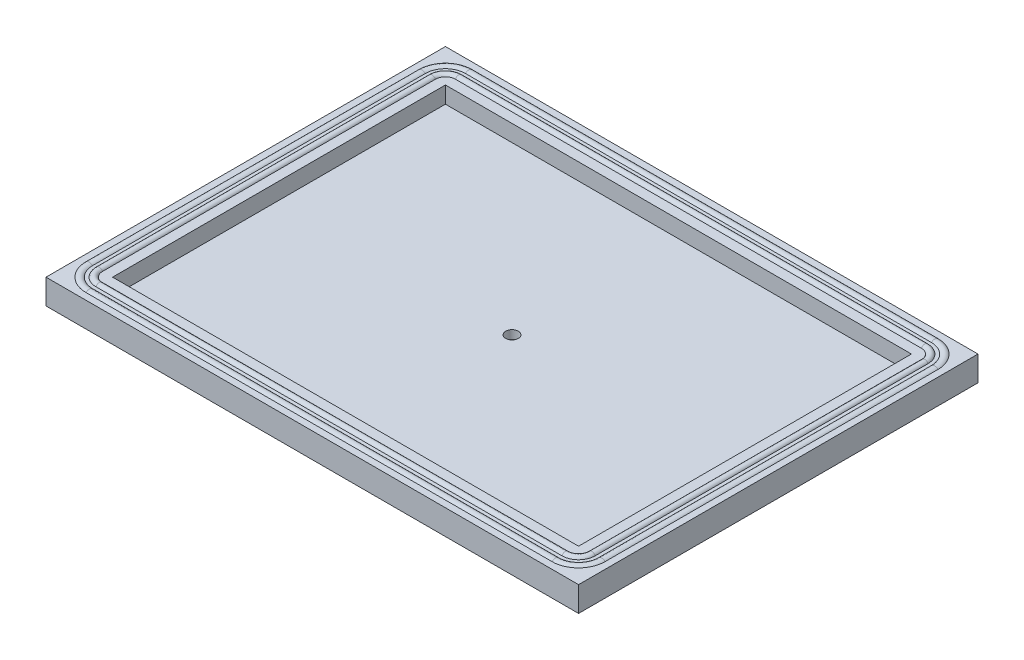
ISO-10303-21;
HEADER;
FILE_DESCRIPTION(('STEP AP214'),'2;1');
FILE_NAME('part.step','',(''),(''),'','','');
FILE_SCHEMA(('AUTOMOTIVE_DESIGN { 1 0 10303 214 1 1 1 1 }'));
ENDSEC;
DATA;
#1=APPLICATION_CONTEXT('core data for automotive mechanical design processes');
#2=APPLICATION_PROTOCOL_DEFINITION('international standard','automotive_design',2000,#1);
#3=PRODUCT_CONTEXT('',#1,'mechanical');
#4=PRODUCT('Part','Part','',(#3));
#5=PRODUCT_RELATED_PRODUCT_CATEGORY('part','',(#4));
#6=PRODUCT_DEFINITION_FORMATION('','',#4);
#7=PRODUCT_DEFINITION_CONTEXT('part definition',#1,'design');
#8=PRODUCT_DEFINITION('design','',#6,#7);
#9=PRODUCT_DEFINITION_SHAPE('','',#8);
#10=(LENGTH_UNIT() NAMED_UNIT(*) SI_UNIT(.MILLI.,.METRE.));
#11=(NAMED_UNIT(*) PLANE_ANGLE_UNIT() SI_UNIT($,.RADIAN.));
#12=(NAMED_UNIT(*) SI_UNIT($,.STERADIAN.) SOLID_ANGLE_UNIT());
#13=UNCERTAINTY_MEASURE_WITH_UNIT(LENGTH_MEASURE(1.E-05),#10,'distance_accuracy_value','');
#14=(GEOMETRIC_REPRESENTATION_CONTEXT(3) GLOBAL_UNCERTAINTY_ASSIGNED_CONTEXT((#13)) GLOBAL_UNIT_ASSIGNED_CONTEXT((#10,
#11,#12)) REPRESENTATION_CONTEXT('',''));
#15=CARTESIAN_POINT('',(0.,0.,0.));
#16=DIRECTION('',(0.,0.,1.));
#17=DIRECTION('',(1.,0.,0.));
#18=AXIS2_PLACEMENT_3D('',#15,#16,#17);
#19=CARTESIAN_POINT('',(71.4455159954874,9.525,-53.059627463619));
#20=DIRECTION('',(0.,1.,0.));
#21=DIRECTION('',(0.,0.,1.));
#22=AXIS2_PLACEMENT_3D('',#19,#20,#21);
#23=PLANE('',#22);
#24=CARTESIAN_POINT('',(84.1455159954874,9.525,86.640372536381));
#25=DIRECTION('',(0.,-1.,0.));
#26=DIRECTION('',(0.,0.,-1.));
#27=AXIS2_PLACEMENT_3D('',#24,#25,#26);
#28=CIRCLE('',#27,7.61999999999996);
#29=CARTESIAN_POINT('',(84.1455159954874,9.525,94.2603725363809));
#30=VERTEX_POINT('',#29);
#31=CARTESIAN_POINT('',(76.5255159954874,9.525,86.6403725363809));
#32=VERTEX_POINT('',#31);
#33=EDGE_CURVE('E71',#30,#32,#28,.T.);
#34=ORIENTED_EDGE('',*,*,#33,.F.);
#35=DIRECTION('',(-1.,0.,0.));
#36=VECTOR('',#35,1.);
#37=CARTESIAN_POINT('',(261.945515995487,9.525,94.2603725363809));
#38=LINE('',#37,#36);
#39=CARTESIAN_POINT('',(261.945515995487,9.525,94.2603725363809));
#40=VERTEX_POINT('',#39);
#41=EDGE_CURVE('E269',#40,#30,#38,.T.);
#42=ORIENTED_EDGE('',*,*,#41,.F.);
#43=CARTESIAN_POINT('',(261.945515995487,9.525,86.640372536381));
#44=DIRECTION('',(0.,-1.,0.));
#45=DIRECTION('',(0.,0.,-1.));
#46=AXIS2_PLACEMENT_3D('',#43,#44,#45);
#47=CIRCLE('',#46,7.61999999999996);
#48=CARTESIAN_POINT('',(269.565515995487,9.525,86.640372536381));
#49=VERTEX_POINT('',#48);
#50=EDGE_CURVE('E261',#49,#40,#47,.T.);
#51=ORIENTED_EDGE('',*,*,#50,.F.);
#52=DIRECTION('',(0.,0.,1.));
#53=VECTOR('',#52,1.);
#54=CARTESIAN_POINT('',(269.565515995487,9.525,-40.359627463619));
#55=LINE('',#54,#53);
#56=CARTESIAN_POINT('',(269.565515995487,9.525,-40.359627463619));
#57=VERTEX_POINT('',#56);
#58=EDGE_CURVE('E253',#57,#49,#55,.T.);
#59=ORIENTED_EDGE('',*,*,#58,.F.);
#60=CARTESIAN_POINT('',(261.945515995487,9.525,-40.3596274636191));
#61=DIRECTION('',(0.,-1.,0.));
#62=DIRECTION('',(0.,0.,-1.));
#63=AXIS2_PLACEMENT_3D('',#60,#61,#62);
#64=CIRCLE('',#63,7.62000000000004);
#65=CARTESIAN_POINT('',(261.945515995487,9.525,-47.9796274636191));
#66=VERTEX_POINT('',#65);
#67=EDGE_CURVE('E245',#66,#57,#64,.T.);
#68=ORIENTED_EDGE('',*,*,#67,.F.);
#69=DIRECTION('',(1.,0.,0.));
#70=VECTOR('',#69,1.);
#71=CARTESIAN_POINT('',(84.1455159954874,9.525,-47.979627463619));
#72=LINE('',#71,#70);
#73=CARTESIAN_POINT('',(84.1455159954874,9.525,-47.979627463619));
#74=VERTEX_POINT('',#73);
#75=EDGE_CURVE('E229',#74,#66,#72,.T.);
#76=ORIENTED_EDGE('',*,*,#75,.F.);
#77=CARTESIAN_POINT('',(84.1455159954874,9.525,-40.359627463619));
#78=DIRECTION('',(0.,-1.,0.));
#79=DIRECTION('',(0.,0.,-1.));
#80=AXIS2_PLACEMENT_3D('',#77,#78,#79);
#81=CIRCLE('',#80,7.62);
#82=CARTESIAN_POINT('',(76.5255159954874,9.525,-40.359627463619));
#83=VERTEX_POINT('',#82);
#84=EDGE_CURVE('E212',#83,#74,#81,.T.);
#85=ORIENTED_EDGE('',*,*,#84,.F.);
#86=DIRECTION('',(0.,0.,1.));
#87=VECTOR('',#86,1.);
#88=CARTESIAN_POINT('',(76.5255159954874,9.525,-40.359627463619));
#89=LINE('',#88,#87);
#90=EDGE_CURVE('E220',#83,#32,#89,.T.);
#91=ORIENTED_EDGE('',*,*,#90,.T.);
#92=EDGE_LOOP('',(#34,#42,#51,#59,#68,#76,#85,#91));
#93=FACE_BOUND('',#92,.T.);
#94=CARTESIAN_POINT('',(84.1455159954874,9.525,86.640372536381));
#95=DIRECTION('',(0.,-1.,0.));
#96=DIRECTION('',(0.,0.,-1.));
#97=AXIS2_PLACEMENT_3D('',#94,#95,#96);
#98=CIRCLE('',#97,6.34999999999991);
#99=CARTESIAN_POINT('',(84.1455159954874,9.525,92.9903725363809));
#100=VERTEX_POINT('',#99);
#101=CARTESIAN_POINT('',(77.7955159954875,9.525,86.6403725363809));
#102=VERTEX_POINT('',#101);
#103=EDGE_CURVE('E337',#100,#102,#98,.T.);
#104=ORIENTED_EDGE('',*,*,#103,.T.);
#105=DIRECTION('',(0.,0.,1.));
#106=VECTOR('',#105,1.);
#107=CARTESIAN_POINT('',(77.7955159954874,9.525,-40.359627463619));
#108=LINE('',#107,#106);
#109=CARTESIAN_POINT('',(77.7955159954874,9.525,-40.359627463619));
#110=VERTEX_POINT('',#109);
#111=EDGE_CURVE('E284',#110,#102,#108,.T.);
#112=ORIENTED_EDGE('',*,*,#111,.F.);
#113=CARTESIAN_POINT('',(84.1455159954874,9.525,-40.359627463619));
#114=DIRECTION('',(0.,-1.,0.));
#115=DIRECTION('',(0.,0.,-1.));
#116=AXIS2_PLACEMENT_3D('',#113,#114,#115);
#117=CIRCLE('',#116,6.34999999999998);
#118=CARTESIAN_POINT('',(84.1455159954874,9.525,-46.709627463619));
#119=VERTEX_POINT('',#118);
#120=EDGE_CURVE('E287',#110,#119,#117,.T.);
#121=ORIENTED_EDGE('',*,*,#120,.T.);
#122=DIRECTION('',(1.,0.,0.));
#123=VECTOR('',#122,1.);
#124=CARTESIAN_POINT('',(84.1455159954874,9.525,-46.709627463619));
#125=LINE('',#124,#123);
#126=CARTESIAN_POINT('',(261.945515995487,9.525,-46.7096274636191));
#127=VERTEX_POINT('',#126);
#128=EDGE_CURVE('E296',#119,#127,#125,.T.);
#129=ORIENTED_EDGE('',*,*,#128,.T.);
#130=CARTESIAN_POINT('',(261.945515995487,9.525,-40.3596274636191));
#131=DIRECTION('',(0.,-1.,0.));
#132=DIRECTION('',(0.,0.,-1.));
#133=AXIS2_PLACEMENT_3D('',#130,#131,#132);
#134=CIRCLE('',#133,6.35000000000002);
#135=CARTESIAN_POINT('',(268.295515995487,9.525,-40.359627463619));
#136=VERTEX_POINT('',#135);
#137=EDGE_CURVE('E304',#127,#136,#134,.T.);
#138=ORIENTED_EDGE('',*,*,#137,.T.);
#139=DIRECTION('',(0.,0.,1.));
#140=VECTOR('',#139,1.);
#141=CARTESIAN_POINT('',(268.295515995487,9.525,-40.359627463619));
#142=LINE('',#141,#140);
#143=CARTESIAN_POINT('',(268.295515995487,9.525,86.640372536381));
#144=VERTEX_POINT('',#143);
#145=EDGE_CURVE('E312',#136,#144,#142,.T.);
#146=ORIENTED_EDGE('',*,*,#145,.T.);
#147=CARTESIAN_POINT('',(261.945515995487,9.525,86.640372536381));
#148=DIRECTION('',(0.,-1.,0.));
#149=DIRECTION('',(0.,0.,-1.));
#150=AXIS2_PLACEMENT_3D('',#147,#148,#149);
#151=CIRCLE('',#150,6.34999999999991);
#152=CARTESIAN_POINT('',(261.945515995487,9.525,92.9903725363809));
#153=VERTEX_POINT('',#152);
#154=EDGE_CURVE('E320',#144,#153,#151,.T.);
#155=ORIENTED_EDGE('',*,*,#154,.T.);
#156=DIRECTION('',(-1.,0.,0.));
#157=VECTOR('',#156,1.);
#158=CARTESIAN_POINT('',(261.945515995487,9.525,92.9903725363809));
#159=LINE('',#158,#157);
#160=EDGE_CURVE('E328',#153,#100,#159,.T.);
#161=ORIENTED_EDGE('',*,*,#160,.T.);
#162=EDGE_LOOP('',(#104,#112,#121,#129,#138,#146,#155,#161));
#163=FACE_BOUND('',#162,.T.);
#164=ADVANCED_FACE('F47',(#93,#163),#23,.T.);
#165=CARTESIAN_POINT('',(84.1455159954874,8.90587499999998,86.640372536381));
#166=DIRECTION('',(0.,-1.,0.));
#167=DIRECTION('',(0.,0.,-1.));
#168=AXIS2_PLACEMENT_3D('',#165,#166,#167);
#169=TOROIDAL_SURFACE('',#168,5.07999999999992,1.412875);
#170=CARTESIAN_POINT('',(84.1455159954874,8.90587499999998,91.7203725363809));
#171=DIRECTION('',(-1.,0.,0.));
#172=DIRECTION('',(0.,0.,1.));
#173=AXIS2_PLACEMENT_3D('',#170,#171,#172);
#174=CIRCLE('',#173,1.412875);
#175=CARTESIAN_POINT('',(84.1455159954874,9.52500000000001,90.4503725363809));
#176=VERTEX_POINT('',#175);
#177=EDGE_CURVE('E326',#100,#176,#174,.T.);
#178=ORIENTED_EDGE('',*,*,#177,.T.);
#179=CARTESIAN_POINT('',(84.1455159954874,9.52500000000001,86.640372536381));
#180=DIRECTION('',(0.,-1.,0.));
#181=DIRECTION('',(0.,0.,-1.));
#182=AXIS2_PLACEMENT_3D('',#179,#180,#181);
#183=CIRCLE('',#182,3.80999999999992);
#184=CARTESIAN_POINT('',(80.3355159954874,9.525,86.6403725363809));
#185=VERTEX_POINT('',#184);
#186=EDGE_CURVE('E340',#176,#185,#183,.T.);
#187=ORIENTED_EDGE('',*,*,#186,.T.);
#188=CARTESIAN_POINT('',(79.0655159954875,8.90587499999998,86.6403725363809));
#189=DIRECTION('',(0.,0.,-1.));
#190=DIRECTION('',(-1.,0.,0.));
#191=AXIS2_PLACEMENT_3D('',#188,#189,#190);
#192=CIRCLE('',#191,1.412875);
#193=EDGE_CURVE('E334',#102,#185,#192,.T.);
#194=ORIENTED_EDGE('',*,*,#193,.F.);
#195=ORIENTED_EDGE('',*,*,#103,.F.);
#196=EDGE_LOOP('',(#178,#187,#194,#195));
#197=FACE_BOUND('',#196,.T.);
#198=ADVANCED_FACE('F430',(#197),#169,.T.);
#199=CARTESIAN_POINT('',(261.945515995487,8.90587499999998,91.7203725363809));
#200=DIRECTION('',(-1.,0.,0.));
#201=DIRECTION('',(0.,0.,1.));
#202=AXIS2_PLACEMENT_3D('',#199,#200,#201);
#203=CYLINDRICAL_SURFACE('',#202,1.412875);
#204=CARTESIAN_POINT('',(261.945515995487,8.90587499999998,91.7203725363809));
#205=DIRECTION('',(-1.,0.,0.));
#206=DIRECTION('',(0.,0.,1.));
#207=AXIS2_PLACEMENT_3D('',#204,#205,#206);
#208=CIRCLE('',#207,1.412875);
#209=CARTESIAN_POINT('',(261.945515995487,9.52500000000001,90.4503725363809));
#210=VERTEX_POINT('',#209);
#211=EDGE_CURVE('E318',#153,#210,#208,.T.);
#212=ORIENTED_EDGE('',*,*,#211,.T.);
#213=DIRECTION('',(-1.,0.,0.));
#214=VECTOR('',#213,1.);
#215=CARTESIAN_POINT('',(261.945515995487,9.52500000000001,90.4503725363809));
#216=LINE('',#215,#214);
#217=EDGE_CURVE('E331',#210,#176,#216,.T.);
#218=ORIENTED_EDGE('',*,*,#217,.T.);
#219=ORIENTED_EDGE('',*,*,#177,.F.);
#220=ORIENTED_EDGE('',*,*,#160,.F.);
#221=EDGE_LOOP('',(#212,#218,#219,#220));
#222=FACE_BOUND('',#221,.T.);
#223=ADVANCED_FACE('F436',(#222),#203,.T.);
#224=CARTESIAN_POINT('',(261.945515995487,8.90587499999998,86.640372536381));
#225=DIRECTION('',(0.,-1.,0.));
#226=DIRECTION('',(0.,0.,-1.));
#227=AXIS2_PLACEMENT_3D('',#224,#225,#226);
#228=TOROIDAL_SURFACE('',#227,5.07999999999992,1.412875);
#229=CARTESIAN_POINT('',(267.025515995487,8.90587499999998,86.640372536381));
#230=DIRECTION('',(0.,0.,1.));
#231=DIRECTION('',(1.,0.,0.));
#232=AXIS2_PLACEMENT_3D('',#229,#230,#231);
#233=CIRCLE('',#232,1.412875);
#234=CARTESIAN_POINT('',(265.755515995487,9.52500000000001,86.640372536381));
#235=VERTEX_POINT('',#234);
#236=EDGE_CURVE('E310',#144,#235,#233,.T.);
#237=ORIENTED_EDGE('',*,*,#236,.T.);
#238=CARTESIAN_POINT('',(261.945515995487,9.52500000000001,86.640372536381));
#239=DIRECTION('',(0.,-1.,0.));
#240=DIRECTION('',(0.,0.,-1.));
#241=AXIS2_PLACEMENT_3D('',#238,#239,#240);
#242=CIRCLE('',#241,3.80999999999992);
#243=EDGE_CURVE('E323',#235,#210,#242,.T.);
#244=ORIENTED_EDGE('',*,*,#243,.T.);
#245=ORIENTED_EDGE('',*,*,#211,.F.);
#246=ORIENTED_EDGE('',*,*,#154,.F.);
#247=EDGE_LOOP('',(#237,#244,#245,#246));
#248=FACE_BOUND('',#247,.T.);
#249=ADVANCED_FACE('F666',(#248),#228,.T.);
#250=CARTESIAN_POINT('',(267.025515995487,8.90587499999998,-40.359627463619));
#251=DIRECTION('',(0.,0.,1.));
#252=DIRECTION('',(1.,0.,0.));
#253=AXIS2_PLACEMENT_3D('',#250,#251,#252);
#254=CYLINDRICAL_SURFACE('',#253,1.412875);
#255=CARTESIAN_POINT('',(267.025515995487,8.90587499999998,-40.359627463619));
#256=DIRECTION('',(0.,0.,1.));
#257=DIRECTION('',(1.,0.,0.));
#258=AXIS2_PLACEMENT_3D('',#255,#256,#257);
#259=CIRCLE('',#258,1.412875);
#260=CARTESIAN_POINT('',(265.755515995487,9.52500000000001,-40.359627463619));
#261=VERTEX_POINT('',#260);
#262=EDGE_CURVE('E302',#136,#261,#259,.T.);
#263=ORIENTED_EDGE('',*,*,#262,.T.);
#264=DIRECTION('',(0.,0.,1.));
#265=VECTOR('',#264,1.);
#266=CARTESIAN_POINT('',(265.755515995487,9.52500000000001,-40.359627463619));
#267=LINE('',#266,#265);
#268=EDGE_CURVE('E315',#261,#235,#267,.T.);
#269=ORIENTED_EDGE('',*,*,#268,.T.);
#270=ORIENTED_EDGE('',*,*,#236,.F.);
#271=ORIENTED_EDGE('',*,*,#145,.F.);
#272=EDGE_LOOP('',(#263,#269,#270,#271));
#273=FACE_BOUND('',#272,.T.);
#274=ADVANCED_FACE('F656',(#273),#254,.T.);
#275=CARTESIAN_POINT('',(261.945515995487,8.90587499999998,-40.3596274636191));
#276=DIRECTION('',(0.,-1.,0.));
#277=DIRECTION('',(0.,0.,-1.));
#278=AXIS2_PLACEMENT_3D('',#275,#276,#277);
#279=TOROIDAL_SURFACE('',#278,5.08000000000004,1.412875);
#280=CARTESIAN_POINT('',(261.945515995487,8.90587499999998,-45.4396274636191));
#281=DIRECTION('',(1.,0.,0.));
#282=DIRECTION('',(0.,0.,-1.));
#283=AXIS2_PLACEMENT_3D('',#280,#281,#282);
#284=CIRCLE('',#283,1.412875);
#285=CARTESIAN_POINT('',(261.945515995487,9.52500000000001,-44.1696274636191));
#286=VERTEX_POINT('',#285);
#287=EDGE_CURVE('E294',#127,#286,#284,.T.);
#288=ORIENTED_EDGE('',*,*,#287,.T.);
#289=CARTESIAN_POINT('',(261.945515995487,9.52500000000001,-40.3596274636191));
#290=DIRECTION('',(0.,-1.,0.));
#291=DIRECTION('',(0.,0.,-1.));
#292=AXIS2_PLACEMENT_3D('',#289,#290,#291);
#293=CIRCLE('',#292,3.81000000000003);
#294=EDGE_CURVE('E307',#286,#261,#293,.T.);
#295=ORIENTED_EDGE('',*,*,#294,.T.);
#296=ORIENTED_EDGE('',*,*,#262,.F.);
#297=ORIENTED_EDGE('',*,*,#137,.F.);
#298=EDGE_LOOP('',(#288,#295,#296,#297));
#299=FACE_BOUND('',#298,.T.);
#300=ADVANCED_FACE('F646',(#299),#279,.T.);
#301=CARTESIAN_POINT('',(84.1455159954874,8.90587499999998,-45.439627463619));
#302=DIRECTION('',(1.,0.,0.));
#303=DIRECTION('',(0.,0.,-1.));
#304=AXIS2_PLACEMENT_3D('',#301,#302,#303);
#305=CYLINDRICAL_SURFACE('',#304,1.412875);
#306=CARTESIAN_POINT('',(84.1455159954874,8.90587499999998,-45.439627463619));
#307=DIRECTION('',(1.,0.,0.));
#308=DIRECTION('',(0.,0.,-1.));
#309=AXIS2_PLACEMENT_3D('',#306,#307,#308);
#310=CIRCLE('',#309,1.412875);
#311=CARTESIAN_POINT('',(84.1455159954874,9.52500000000001,-44.169627463619));
#312=VERTEX_POINT('',#311);
#313=EDGE_CURVE('E285',#119,#312,#310,.T.);
#314=ORIENTED_EDGE('',*,*,#313,.T.);
#315=DIRECTION('',(1.,0.,0.));
#316=VECTOR('',#315,1.);
#317=CARTESIAN_POINT('',(84.1455159954874,9.52500000000001,-44.169627463619));
#318=LINE('',#317,#316);
#319=EDGE_CURVE('E299',#312,#286,#318,.T.);
#320=ORIENTED_EDGE('',*,*,#319,.T.);
#321=ORIENTED_EDGE('',*,*,#287,.F.);
#322=ORIENTED_EDGE('',*,*,#128,.F.);
#323=EDGE_LOOP('',(#314,#320,#321,#322));
#324=FACE_BOUND('',#323,.T.);
#325=ADVANCED_FACE('F636',(#324),#305,.T.);
#326=CARTESIAN_POINT('',(84.1455159954874,8.90587499999998,-40.359627463619));
#327=DIRECTION('',(0.,-1.,0.));
#328=DIRECTION('',(0.,0.,-1.));
#329=AXIS2_PLACEMENT_3D('',#326,#327,#328);
#330=TOROIDAL_SURFACE('',#329,5.08,1.412875);
#331=CARTESIAN_POINT('',(79.0655159954874,8.90587499999998,-40.359627463619));
#332=DIRECTION('',(0.,0.,-1.));
#333=DIRECTION('',(-1.,0.,0.));
#334=AXIS2_PLACEMENT_3D('',#331,#332,#333);
#335=CIRCLE('',#334,1.412875);
#336=CARTESIAN_POINT('',(80.3355159954874,9.52500000000001,-40.359627463619));
#337=VERTEX_POINT('',#336);
#338=EDGE_CURVE('E276',#110,#337,#335,.T.);
#339=ORIENTED_EDGE('',*,*,#338,.T.);
#340=CARTESIAN_POINT('',(84.1455159954874,9.52500000000001,-40.359627463619));
#341=DIRECTION('',(0.,-1.,0.));
#342=DIRECTION('',(0.,0.,-1.));
#343=AXIS2_PLACEMENT_3D('',#340,#341,#342);
#344=CIRCLE('',#343,3.80999999999999);
#345=EDGE_CURVE('E291',#337,#312,#344,.T.);
#346=ORIENTED_EDGE('',*,*,#345,.T.);
#347=ORIENTED_EDGE('',*,*,#313,.F.);
#348=ORIENTED_EDGE('',*,*,#120,.F.);
#349=EDGE_LOOP('',(#339,#346,#347,#348));
#350=FACE_BOUND('',#349,.T.);
#351=ADVANCED_FACE('F625',(#350),#330,.T.);
#352=CARTESIAN_POINT('',(79.0655159954874,8.90587499999998,-40.359627463619));
#353=DIRECTION('',(0.,0.,1.));
#354=DIRECTION('',(1.,0.,0.));
#355=AXIS2_PLACEMENT_3D('',#352,#353,#354);
#356=CYLINDRICAL_SURFACE('',#355,1.412875);
#357=ORIENTED_EDGE('',*,*,#111,.T.);
#358=ORIENTED_EDGE('',*,*,#193,.T.);
#359=DIRECTION('',(0.,0.,1.));
#360=VECTOR('',#359,1.);
#361=CARTESIAN_POINT('',(80.3355159954874,9.52500000000001,-40.359627463619));
#362=LINE('',#361,#360);
#363=EDGE_CURVE('E288',#337,#185,#362,.T.);
#364=ORIENTED_EDGE('',*,*,#363,.F.);
#365=ORIENTED_EDGE('',*,*,#338,.F.);
#366=EDGE_LOOP('',(#357,#358,#364,#365));
#367=FACE_BOUND('',#366,.T.);
#368=ADVANCED_FACE('F483',(#367),#356,.T.);
#369=CARTESIAN_POINT('',(71.4455159954874,3.175,-53.059627463619));
#370=DIRECTION('',(0.,1.,0.));
#371=DIRECTION('',(0.,0.,1.));
#372=AXIS2_PLACEMENT_3D('',#369,#370,#371);
#373=PLANE('',#372);
#374=CARTESIAN_POINT('',(173.045515995487,3.175,23.140372536381));
#375=DIRECTION('',(0.,1.,0.));
#376=DIRECTION('',(0.,0.,1.));
#377=AXIS2_PLACEMENT_3D('',#374,#375,#376);
#378=CIRCLE('',#377,2.413);
#379=CARTESIAN_POINT('',(173.045515995487,3.175,25.553372536381));
#380=VERTEX_POINT('',#379);
#381=EDGE_CURVE('E51',#380,#380,#378,.T.);
#382=ORIENTED_EDGE('',*,*,#381,.F.);
#383=EDGE_LOOP('',(#382));
#384=FACE_BOUND('',#383,.T.);
#385=DIRECTION('',(1.,0.,0.));
#386=VECTOR('',#385,1.);
#387=CARTESIAN_POINT('',(261.945515995487,3.17500000000001,-40.3596274636191));
#388=LINE('',#387,#386);
#389=CARTESIAN_POINT('',(84.1455159954874,3.17500000000001,-40.359627463619));
#390=VERTEX_POINT('',#389);
#391=CARTESIAN_POINT('',(261.945515995487,3.17500000000001,-40.3596274636191));
#392=VERTEX_POINT('',#391);
#393=EDGE_CURVE('E355',#390,#392,#388,.T.);
#394=ORIENTED_EDGE('',*,*,#393,.F.);
#395=DIRECTION('',(0.,0.,-1.));
#396=VECTOR('',#395,1.);
#397=CARTESIAN_POINT('',(84.1455159954874,3.17500000000001,86.640372536381));
#398=LINE('',#397,#396);
#399=CARTESIAN_POINT('',(84.1455159954874,3.17500000000001,86.640372536381));
#400=VERTEX_POINT('',#399);
#401=EDGE_CURVE('E357',#400,#390,#398,.T.);
#402=ORIENTED_EDGE('',*,*,#401,.F.);
#403=DIRECTION('',(-1.,0.,0.));
#404=VECTOR('',#403,1.);
#405=CARTESIAN_POINT('',(261.945515995487,3.17500000000001,86.640372536381));
#406=LINE('',#405,#404);
#407=CARTESIAN_POINT('',(261.945515995487,3.17500000000001,86.640372536381));
#408=VERTEX_POINT('',#407);
#409=EDGE_CURVE('E350',#408,#400,#406,.T.);
#410=ORIENTED_EDGE('',*,*,#409,.F.);
#411=DIRECTION('',(0.,0.,1.));
#412=VECTOR('',#411,1.);
#413=CARTESIAN_POINT('',(261.945515995487,3.17500000000001,86.640372536381));
#414=LINE('',#413,#412);
#415=EDGE_CURVE('E352',#392,#408,#414,.T.);
#416=ORIENTED_EDGE('',*,*,#415,.F.);
#417=EDGE_LOOP('',(#394,#402,#410,#416));
#418=FACE_BOUND('',#417,.T.);
#419=ADVANCED_FACE('F479',(#384,#418),#373,.T.);
#420=CARTESIAN_POINT('',(84.1455159954874,-218.499061782883,86.640372536381));
#421=DIRECTION('',(-1.,0.,0.));
#422=DIRECTION('',(0.,0.,1.));
#423=AXIS2_PLACEMENT_3D('',#420,#421,#422);
#424=PLANE('',#423);
#425=ORIENTED_EDGE('',*,*,#401,.T.);
#426=DIRECTION('',(0.,1.,0.));
#427=VECTOR('',#426,1.);
#428=CARTESIAN_POINT('',(84.1455159954874,-218.499061782883,-40.359627463619));
#429=LINE('',#428,#427);
#430=CARTESIAN_POINT('',(84.1455159954874,9.525,-40.359627463619));
#431=VERTEX_POINT('',#430);
#432=EDGE_CURVE('E368',#390,#431,#429,.T.);
#433=ORIENTED_EDGE('',*,*,#432,.T.);
#434=DIRECTION('',(0.,0.,1.));
#435=VECTOR('',#434,1.);
#436=CARTESIAN_POINT('',(84.1455159954874,9.525,86.640372536381));
#437=LINE('',#436,#435);
#438=CARTESIAN_POINT('',(84.1455159954874,9.525,86.640372536381));
#439=VERTEX_POINT('',#438);
#440=EDGE_CURVE('E359',#431,#439,#437,.T.);
#441=ORIENTED_EDGE('',*,*,#440,.T.);
#442=DIRECTION('',(0.,1.,0.));
#443=VECTOR('',#442,1.);
#444=CARTESIAN_POINT('',(84.1455159954874,-218.499061782883,86.640372536381));
#445=LINE('',#444,#443);
#446=EDGE_CURVE('E372',#400,#439,#445,.T.);
#447=ORIENTED_EDGE('',*,*,#446,.F.);
#448=EDGE_LOOP('',(#425,#433,#441,#447));
#449=FACE_BOUND('',#448,.T.);
#450=ADVANCED_FACE('F482',(#449),#424,.F.);
#451=CARTESIAN_POINT('',(261.945515995487,-218.499061782883,86.640372536381));
#452=DIRECTION('',(0.,0.,1.));
#453=DIRECTION('',(1.,0.,0.));
#454=AXIS2_PLACEMENT_3D('',#451,#452,#453);
#455=PLANE('',#454);
#456=ORIENTED_EDGE('',*,*,#409,.T.);
#457=ORIENTED_EDGE('',*,*,#446,.T.);
#458=DIRECTION('',(1.,0.,0.));
#459=VECTOR('',#458,1.);
#460=CARTESIAN_POINT('',(261.945515995487,9.525,86.640372536381));
#461=LINE('',#460,#459);
#462=CARTESIAN_POINT('',(261.945515995487,9.525,86.640372536381));
#463=VERTEX_POINT('',#462);
#464=EDGE_CURVE('E362',#439,#463,#461,.T.);
#465=ORIENTED_EDGE('',*,*,#464,.T.);
#466=DIRECTION('',(0.,1.,0.));
#467=VECTOR('',#466,1.);
#468=CARTESIAN_POINT('',(261.945515995487,-218.499061782883,86.640372536381));
#469=LINE('',#468,#467);
#470=EDGE_CURVE('E370',#408,#463,#469,.T.);
#471=ORIENTED_EDGE('',*,*,#470,.F.);
#472=EDGE_LOOP('',(#456,#457,#465,#471));
#473=FACE_BOUND('',#472,.T.);
#474=ADVANCED_FACE('F501',(#473),#455,.F.);
#475=CARTESIAN_POINT('',(261.945515995487,-218.499061782883,86.640372536381));
#476=DIRECTION('',(1.,0.,0.));
#477=DIRECTION('',(0.,0.,-1.));
#478=AXIS2_PLACEMENT_3D('',#475,#476,#477);
#479=PLANE('',#478);
#480=ORIENTED_EDGE('',*,*,#415,.T.);
#481=ORIENTED_EDGE('',*,*,#470,.T.);
#482=DIRECTION('',(0.,0.,-1.));
#483=VECTOR('',#482,1.);
#484=CARTESIAN_POINT('',(261.945515995487,9.525,86.640372536381));
#485=LINE('',#484,#483);
#486=CARTESIAN_POINT('',(261.945515995487,9.525,-40.3596274636191));
#487=VERTEX_POINT('',#486);
#488=EDGE_CURVE('E365',#463,#487,#485,.T.);
#489=ORIENTED_EDGE('',*,*,#488,.T.);
#490=DIRECTION('',(0.,1.,0.));
#491=VECTOR('',#490,1.);
#492=CARTESIAN_POINT('',(261.945515995487,-218.499061782883,-40.3596274636191));
#493=LINE('',#492,#491);
#494=EDGE_CURVE('E353',#392,#487,#493,.T.);
#495=ORIENTED_EDGE('',*,*,#494,.F.);
#496=EDGE_LOOP('',(#480,#481,#489,#495));
#497=FACE_BOUND('',#496,.T.);
#498=ADVANCED_FACE('F503',(#497),#479,.F.);
#499=CARTESIAN_POINT('',(261.945515995487,-218.499061782883,-40.3596274636191));
#500=DIRECTION('',(0.,0.,-1.));
#501=DIRECTION('',(-1.,0.,0.));
#502=AXIS2_PLACEMENT_3D('',#499,#500,#501);
#503=PLANE('',#502);
#504=ORIENTED_EDGE('',*,*,#393,.T.);
#505=ORIENTED_EDGE('',*,*,#494,.T.);
#506=DIRECTION('',(-1.,0.,0.));
#507=VECTOR('',#506,1.);
#508=CARTESIAN_POINT('',(261.945515995487,9.525,-40.3596274636191));
#509=LINE('',#508,#507);
#510=EDGE_CURVE('E342',#487,#431,#509,.T.);
#511=ORIENTED_EDGE('',*,*,#510,.T.);
#512=ORIENTED_EDGE('',*,*,#432,.F.);
#513=EDGE_LOOP('',(#504,#505,#511,#512));
#514=FACE_BOUND('',#513,.T.);
#515=ADVANCED_FACE('F443',(#514),#503,.F.);
#516=ORIENTED_EDGE('',*,*,#186,.F.);
#517=ORIENTED_EDGE('',*,*,#217,.F.);
#518=ORIENTED_EDGE('',*,*,#243,.F.);
#519=ORIENTED_EDGE('',*,*,#268,.F.);
#520=ORIENTED_EDGE('',*,*,#294,.F.);
#521=ORIENTED_EDGE('',*,*,#319,.F.);
#522=ORIENTED_EDGE('',*,*,#345,.F.);
#523=ORIENTED_EDGE('',*,*,#363,.T.);
#524=EDGE_LOOP('',(#516,#517,#518,#519,#520,#521,#522,#523));
#525=FACE_BOUND('',#524,.T.);
#526=ORIENTED_EDGE('',*,*,#510,.F.);
#527=ORIENTED_EDGE('',*,*,#488,.F.);
#528=ORIENTED_EDGE('',*,*,#464,.F.);
#529=ORIENTED_EDGE('',*,*,#440,.F.);
#530=EDGE_LOOP('',(#526,#527,#528,#529));
#531=FACE_BOUND('',#530,.T.);
#532=ADVANCED_FACE('F432',(#525,#531),#23,.T.);
#533=CARTESIAN_POINT('',(84.1455159954874,8.19150000000001,86.640372536381));
#534=DIRECTION('',(0.,-1.,0.));
#535=DIRECTION('',(0.,0.,-1.));
#536=AXIS2_PLACEMENT_3D('',#533,#534,#535);
#537=TOROIDAL_SURFACE('',#536,8.88999999999995,1.84149999999999);
#538=CARTESIAN_POINT('',(84.1455159954874,8.19150000000001,95.5303725363809));
#539=DIRECTION('',(-1.,0.,0.));
#540=DIRECTION('',(0.,0.,-1.));
#541=AXIS2_PLACEMENT_3D('',#538,#539,#540);
#542=CIRCLE('',#541,1.84149999999999);
#543=CARTESIAN_POINT('',(84.1455159954874,9.525,96.8003725363809));
#544=VERTEX_POINT('',#543);
#545=EDGE_CURVE('E264',#544,#30,#542,.T.);
#546=ORIENTED_EDGE('',*,*,#545,.T.);
#547=ORIENTED_EDGE('',*,*,#33,.T.);
#548=CARTESIAN_POINT('',(75.2555159954875,8.19150000000001,86.6403725363809));
#549=DIRECTION('',(0.,0.,-1.));
#550=DIRECTION('',(1.,0.,0.));
#551=AXIS2_PLACEMENT_3D('',#548,#549,#550);
#552=CIRCLE('',#551,1.84149999999999);
#553=CARTESIAN_POINT('',(73.9855159954875,9.525,86.6403725363809));
#554=VERTEX_POINT('',#553);
#555=EDGE_CURVE('E222',#554,#32,#552,.T.);
#556=ORIENTED_EDGE('',*,*,#555,.F.);
#557=CARTESIAN_POINT('',(84.1455159954874,9.525,86.640372536381));
#558=DIRECTION('',(0.,-1.,0.));
#559=DIRECTION('',(0.,0.,-1.));
#560=AXIS2_PLACEMENT_3D('',#557,#558,#559);
#561=CIRCLE('',#560,10.1599999999999);
#562=EDGE_CURVE('E273',#544,#554,#561,.T.);
#563=ORIENTED_EDGE('',*,*,#562,.F.);
#564=EDGE_LOOP('',(#546,#547,#556,#563));
#565=FACE_BOUND('',#564,.T.);
#566=ADVANCED_FACE('F442',(#565),#537,.T.);
#567=CARTESIAN_POINT('',(261.945515995487,8.19150000000001,95.5303725363809));
#568=DIRECTION('',(-1.,0.,0.));
#569=DIRECTION('',(0.,0.,1.));
#570=AXIS2_PLACEMENT_3D('',#567,#568,#569);
#571=CYLINDRICAL_SURFACE('',#570,1.84149999999999);
#572=CARTESIAN_POINT('',(261.945515995487,8.19150000000001,95.5303725363809));
#573=DIRECTION('',(-1.,0.,0.));
#574=DIRECTION('',(0.,0.,-1.));
#575=AXIS2_PLACEMENT_3D('',#572,#573,#574);
#576=CIRCLE('',#575,1.84149999999999);
#577=CARTESIAN_POINT('',(261.945515995487,9.525,96.8003725363809));
#578=VERTEX_POINT('',#577);
#579=EDGE_CURVE('E256',#578,#40,#576,.T.);
#580=ORIENTED_EDGE('',*,*,#579,.T.);
#581=ORIENTED_EDGE('',*,*,#41,.T.);
#582=ORIENTED_EDGE('',*,*,#545,.F.);
#583=DIRECTION('',(-1.,0.,0.));
#584=VECTOR('',#583,1.);
#585=CARTESIAN_POINT('',(261.945515995487,9.525,96.8003725363809));
#586=LINE('',#585,#584);
#587=EDGE_CURVE('E266',#578,#544,#586,.T.);
#588=ORIENTED_EDGE('',*,*,#587,.F.);
#589=EDGE_LOOP('',(#580,#581,#582,#588));
#590=FACE_BOUND('',#589,.T.);
#591=ADVANCED_FACE('F455',(#590),#571,.T.);
#592=CARTESIAN_POINT('',(261.945515995487,8.19150000000001,86.640372536381));
#593=DIRECTION('',(0.,-1.,0.));
#594=DIRECTION('',(0.,0.,-1.));
#595=AXIS2_PLACEMENT_3D('',#592,#593,#594);
#596=TOROIDAL_SURFACE('',#595,8.88999999999995,1.84149999999999);
#597=CARTESIAN_POINT('',(270.835515995487,8.19150000000001,86.640372536381));
#598=DIRECTION('',(0.,0.,1.));
#599=DIRECTION('',(-1.,0.,0.));
#600=AXIS2_PLACEMENT_3D('',#597,#598,#599);
#601=CIRCLE('',#600,1.84149999999999);
#602=CARTESIAN_POINT('',(272.105515995487,9.525,86.640372536381));
#603=VERTEX_POINT('',#602);
#604=EDGE_CURVE('E248',#603,#49,#601,.T.);
#605=ORIENTED_EDGE('',*,*,#604,.T.);
#606=ORIENTED_EDGE('',*,*,#50,.T.);
#607=ORIENTED_EDGE('',*,*,#579,.F.);
#608=CARTESIAN_POINT('',(261.945515995487,9.525,86.640372536381));
#609=DIRECTION('',(0.,-1.,0.));
#610=DIRECTION('',(0.,0.,-1.));
#611=AXIS2_PLACEMENT_3D('',#608,#609,#610);
#612=CIRCLE('',#611,10.1599999999999);
#613=EDGE_CURVE('E258',#603,#578,#612,.T.);
#614=ORIENTED_EDGE('',*,*,#613,.F.);
#615=EDGE_LOOP('',(#605,#606,#607,#614));
#616=FACE_BOUND('',#615,.T.);
#617=ADVANCED_FACE('F461',(#616),#596,.T.);
#618=CARTESIAN_POINT('',(270.835515995487,8.19150000000001,-40.359627463619));
#619=DIRECTION('',(0.,0.,1.));
#620=DIRECTION('',(1.,0.,0.));
#621=AXIS2_PLACEMENT_3D('',#618,#619,#620);
#622=CYLINDRICAL_SURFACE('',#621,1.84149999999999);
#623=CARTESIAN_POINT('',(270.835515995487,8.19150000000001,-40.359627463619));
#624=DIRECTION('',(0.,0.,1.));
#625=DIRECTION('',(-1.,0.,0.));
#626=AXIS2_PLACEMENT_3D('',#623,#624,#625);
#627=CIRCLE('',#626,1.84149999999999);
#628=CARTESIAN_POINT('',(272.105515995487,9.525,-40.359627463619));
#629=VERTEX_POINT('',#628);
#630=EDGE_CURVE('E240',#629,#57,#627,.T.);
#631=ORIENTED_EDGE('',*,*,#630,.T.);
#632=ORIENTED_EDGE('',*,*,#58,.T.);
#633=ORIENTED_EDGE('',*,*,#604,.F.);
#634=DIRECTION('',(0.,0.,1.));
#635=VECTOR('',#634,1.);
#636=CARTESIAN_POINT('',(272.105515995487,9.525,-40.359627463619));
#637=LINE('',#636,#635);
#638=EDGE_CURVE('E250',#629,#603,#637,.T.);
#639=ORIENTED_EDGE('',*,*,#638,.F.);
#640=EDGE_LOOP('',(#631,#632,#633,#639));
#641=FACE_BOUND('',#640,.T.);
#642=ADVANCED_FACE('F464',(#641),#622,.T.);
#643=CARTESIAN_POINT('',(261.945515995487,8.19150000000001,-40.3596274636191));
#644=DIRECTION('',(0.,-1.,0.));
#645=DIRECTION('',(0.,0.,-1.));
#646=AXIS2_PLACEMENT_3D('',#643,#644,#645);
#647=TOROIDAL_SURFACE('',#646,8.89000000000003,1.84149999999999);
#648=CARTESIAN_POINT('',(261.945515995487,8.19150000000001,-49.2496274636191));
#649=DIRECTION('',(1.,0.,0.));
#650=DIRECTION('',(0.,0.,1.));
#651=AXIS2_PLACEMENT_3D('',#648,#649,#650);
#652=CIRCLE('',#651,1.84149999999999);
#653=CARTESIAN_POINT('',(261.945515995487,9.525,-50.5196274636191));
#654=VERTEX_POINT('',#653);
#655=EDGE_CURVE('E230',#654,#66,#652,.T.);
#656=ORIENTED_EDGE('',*,*,#655,.T.);
#657=ORIENTED_EDGE('',*,*,#67,.T.);
#658=ORIENTED_EDGE('',*,*,#630,.F.);
#659=CARTESIAN_POINT('',(261.945515995487,9.525,-40.3596274636191));
#660=DIRECTION('',(0.,-1.,0.));
#661=DIRECTION('',(0.,0.,-1.));
#662=AXIS2_PLACEMENT_3D('',#659,#660,#661);
#663=CIRCLE('',#662,10.16);
#664=EDGE_CURVE('E242',#654,#629,#663,.T.);
#665=ORIENTED_EDGE('',*,*,#664,.F.);
#666=EDGE_LOOP('',(#656,#657,#658,#665));
#667=FACE_BOUND('',#666,.T.);
#668=ADVANCED_FACE('F467',(#667),#647,.T.);
#669=CARTESIAN_POINT('',(84.1455159954874,8.19150000000001,-49.249627463619));
#670=DIRECTION('',(1.,0.,0.));
#671=DIRECTION('',(0.,0.,-1.));
#672=AXIS2_PLACEMENT_3D('',#669,#670,#671);
#673=CYLINDRICAL_SURFACE('',#672,1.84149999999999);
#674=CARTESIAN_POINT('',(84.1455159954874,8.19150000000001,-49.249627463619));
#675=DIRECTION('',(1.,0.,0.));
#676=DIRECTION('',(0.,0.,1.));
#677=AXIS2_PLACEMENT_3D('',#674,#675,#676);
#678=CIRCLE('',#677,1.84149999999999);
#679=CARTESIAN_POINT('',(84.1455159954874,9.525,-50.519627463619));
#680=VERTEX_POINT('',#679);
#681=EDGE_CURVE('E224',#680,#74,#678,.T.);
#682=ORIENTED_EDGE('',*,*,#681,.T.);
#683=ORIENTED_EDGE('',*,*,#75,.T.);
#684=ORIENTED_EDGE('',*,*,#655,.F.);
#685=DIRECTION('',(1.,0.,0.));
#686=VECTOR('',#685,1.);
#687=CARTESIAN_POINT('',(84.1455159954874,9.525,-50.519627463619));
#688=LINE('',#687,#686);
#689=EDGE_CURVE('E232',#680,#654,#688,.T.);
#690=ORIENTED_EDGE('',*,*,#689,.F.);
#691=EDGE_LOOP('',(#682,#683,#684,#690));
#692=FACE_BOUND('',#691,.T.);
#693=ADVANCED_FACE('F470',(#692),#673,.T.);
#694=CARTESIAN_POINT('',(84.1455159954874,8.19150000000001,-40.359627463619));
#695=DIRECTION('',(0.,-1.,0.));
#696=DIRECTION('',(0.,0.,-1.));
#697=AXIS2_PLACEMENT_3D('',#694,#695,#696);
#698=TOROIDAL_SURFACE('',#697,8.89,1.84149999999999);
#699=CARTESIAN_POINT('',(75.2555159954874,8.19150000000001,-40.359627463619));
#700=DIRECTION('',(0.,0.,-1.));
#701=DIRECTION('',(1.,0.,0.));
#702=AXIS2_PLACEMENT_3D('',#699,#700,#701);
#703=CIRCLE('',#702,1.84149999999999);
#704=CARTESIAN_POINT('',(73.9855159954874,9.525,-40.359627463619));
#705=VERTEX_POINT('',#704);
#706=EDGE_CURVE('E63',#705,#83,#703,.T.);
#707=ORIENTED_EDGE('',*,*,#706,.T.);
#708=ORIENTED_EDGE('',*,*,#84,.T.);
#709=ORIENTED_EDGE('',*,*,#681,.F.);
#710=CARTESIAN_POINT('',(84.1455159954874,9.525,-40.359627463619));
#711=DIRECTION('',(0.,-1.,0.));
#712=DIRECTION('',(0.,0.,-1.));
#713=AXIS2_PLACEMENT_3D('',#710,#711,#712);
#714=CIRCLE('',#713,10.16);
#715=EDGE_CURVE('E215',#705,#680,#714,.T.);
#716=ORIENTED_EDGE('',*,*,#715,.F.);
#717=EDGE_LOOP('',(#707,#708,#709,#716));
#718=FACE_BOUND('',#717,.T.);
#719=ADVANCED_FACE('F209',(#718),#698,.T.);
#720=CARTESIAN_POINT('',(75.2555159954874,8.19150000000001,-40.359627463619));
#721=DIRECTION('',(0.,0.,1.));
#722=DIRECTION('',(1.,0.,0.));
#723=AXIS2_PLACEMENT_3D('',#720,#721,#722);
#724=CYLINDRICAL_SURFACE('',#723,1.84149999999999);
#725=DIRECTION('',(0.,0.,1.));
#726=VECTOR('',#725,1.);
#727=CARTESIAN_POINT('',(73.9855159954874,9.525,-40.359627463619));
#728=LINE('',#727,#726);
#729=EDGE_CURVE('E217',#705,#554,#728,.T.);
#730=ORIENTED_EDGE('',*,*,#729,.T.);
#731=ORIENTED_EDGE('',*,*,#555,.T.);
#732=ORIENTED_EDGE('',*,*,#90,.F.);
#733=ORIENTED_EDGE('',*,*,#706,.F.);
#734=EDGE_LOOP('',(#730,#731,#732,#733));
#735=FACE_BOUND('',#734,.T.);
#736=ADVANCED_FACE('F221',(#735),#724,.T.);
#737=CARTESIAN_POINT('',(71.4455159954874,0.,-53.059627463619));
#738=DIRECTION('',(0.,1.,0.));
#739=DIRECTION('',(0.,0.,1.));
#740=AXIS2_PLACEMENT_3D('',#737,#738,#739);
#741=PLANE('',#740);
#742=CARTESIAN_POINT('',(173.045515995487,0.,23.140372536381));
#743=DIRECTION('',(0.,-1.,0.));
#744=DIRECTION('',(0.,0.,-1.));
#745=AXIS2_PLACEMENT_3D('',#742,#743,#744);
#746=CIRCLE('',#745,2.413);
#747=CARTESIAN_POINT('',(173.045515995487,0.,20.727372536381));
#748=VERTEX_POINT('',#747);
#749=EDGE_CURVE('E472',#748,#748,#746,.T.);
#750=ORIENTED_EDGE('',*,*,#749,.F.);
#751=EDGE_LOOP('',(#750));
#752=FACE_BOUND('',#751,.T.);
#753=DIRECTION('',(-1.,0.,0.));
#754=VECTOR('',#753,1.);
#755=CARTESIAN_POINT('',(274.645515995487,0.,-53.059627463619));
#756=LINE('',#755,#754);
#757=CARTESIAN_POINT('',(274.645515995487,0.,-53.059627463619));
#758=VERTEX_POINT('',#757);
#759=CARTESIAN_POINT('',(71.4455159954874,0.,-53.059627463619));
#760=VERTEX_POINT('',#759);
#761=EDGE_CURVE('E377',#758,#760,#756,.T.);
#762=ORIENTED_EDGE('',*,*,#761,.F.);
#763=DIRECTION('',(0.,0.,-1.));
#764=VECTOR('',#763,1.);
#765=CARTESIAN_POINT('',(274.645515995487,0.,99.3403725363809));
#766=LINE('',#765,#764);
#767=CARTESIAN_POINT('',(274.645515995487,0.,99.3403725363809));
#768=VERTEX_POINT('',#767);
#769=EDGE_CURVE('E382',#768,#758,#766,.T.);
#770=ORIENTED_EDGE('',*,*,#769,.F.);
#771=DIRECTION('',(1.,0.,0.));
#772=VECTOR('',#771,1.);
#773=CARTESIAN_POINT('',(71.4455159954874,0.,99.340372536381));
#774=LINE('',#773,#772);
#775=CARTESIAN_POINT('',(71.4455159954874,0.,99.340372536381));
#776=VERTEX_POINT('',#775);
#777=EDGE_CURVE('E393',#776,#768,#774,.T.);
#778=ORIENTED_EDGE('',*,*,#777,.F.);
#779=DIRECTION('',(0.,0.,1.));
#780=VECTOR('',#779,1.);
#781=CARTESIAN_POINT('',(71.4455159954874,0.,-53.059627463619));
#782=LINE('',#781,#780);
#783=EDGE_CURVE('E391',#760,#776,#782,.T.);
#784=ORIENTED_EDGE('',*,*,#783,.F.);
#785=EDGE_LOOP('',(#762,#770,#778,#784));
#786=FACE_BOUND('',#785,.T.);
#787=ADVANCED_FACE('F412',(#752,#786),#741,.F.);
#788=CARTESIAN_POINT('',(274.645515995487,9.525,99.3403725363809));
#789=DIRECTION('',(-1.,0.,0.));
#790=DIRECTION('',(0.,0.,1.));
#791=AXIS2_PLACEMENT_3D('',#788,#789,#790);
#792=PLANE('',#791);
#793=ORIENTED_EDGE('',*,*,#769,.T.);
#794=DIRECTION('',(0.,-1.,0.));
#795=VECTOR('',#794,1.);
#796=CARTESIAN_POINT('',(274.645515995487,9.525,-53.059627463619));
#797=LINE('',#796,#795);
#798=CARTESIAN_POINT('',(274.645515995487,9.525,-53.059627463619));
#799=VERTEX_POINT('',#798);
#800=EDGE_CURVE('E388',#799,#758,#797,.T.);
#801=ORIENTED_EDGE('',*,*,#800,.F.);
#802=DIRECTION('',(0.,0.,-1.));
#803=VECTOR('',#802,1.);
#804=CARTESIAN_POINT('',(274.645515995487,9.525,99.3403725363809));
#805=LINE('',#804,#803);
#806=CARTESIAN_POINT('',(274.645515995487,9.525,99.3403725363809));
#807=VERTEX_POINT('',#806);
#808=EDGE_CURVE('E386',#807,#799,#805,.T.);
#809=ORIENTED_EDGE('',*,*,#808,.F.);
#810=DIRECTION('',(0.,-1.,0.));
#811=VECTOR('',#810,1.);
#812=CARTESIAN_POINT('',(274.645515995487,9.525,99.3403725363809));
#813=LINE('',#812,#811);
#814=EDGE_CURVE('E398',#807,#768,#813,.T.);
#815=ORIENTED_EDGE('',*,*,#814,.T.);
#816=EDGE_LOOP('',(#793,#801,#809,#815));
#817=FACE_BOUND('',#816,.T.);
#818=ADVANCED_FACE('F415',(#817),#792,.F.);
#819=CARTESIAN_POINT('',(71.4455159954874,9.525,99.340372536381));
#820=DIRECTION('',(0.,0.,-1.));
#821=DIRECTION('',(-1.,0.,0.));
#822=AXIS2_PLACEMENT_3D('',#819,#820,#821);
#823=PLANE('',#822);
#824=ORIENTED_EDGE('',*,*,#777,.T.);
#825=ORIENTED_EDGE('',*,*,#814,.F.);
#826=DIRECTION('',(1.,0.,0.));
#827=VECTOR('',#826,1.);
#828=CARTESIAN_POINT('',(71.4455159954874,9.525,99.340372536381));
#829=LINE('',#828,#827);
#830=CARTESIAN_POINT('',(71.4455159954874,9.525,99.340372536381));
#831=VERTEX_POINT('',#830);
#832=EDGE_CURVE('E384',#831,#807,#829,.T.);
#833=ORIENTED_EDGE('',*,*,#832,.F.);
#834=DIRECTION('',(0.,-1.,0.));
#835=VECTOR('',#834,1.);
#836=CARTESIAN_POINT('',(71.4455159954874,9.525,99.340372536381));
#837=LINE('',#836,#835);
#838=EDGE_CURVE('E56',#831,#776,#837,.T.);
#839=ORIENTED_EDGE('',*,*,#838,.T.);
#840=EDGE_LOOP('',(#824,#825,#833,#839));
#841=FACE_BOUND('',#840,.T.);
#842=ADVANCED_FACE('F406',(#841),#823,.F.);
#843=CARTESIAN_POINT('',(71.4455159954874,9.525,-53.059627463619));
#844=DIRECTION('',(1.,0.,0.));
#845=DIRECTION('',(0.,0.,-1.));
#846=AXIS2_PLACEMENT_3D('',#843,#844,#845);
#847=PLANE('',#846);
#848=ORIENTED_EDGE('',*,*,#783,.T.);
#849=ORIENTED_EDGE('',*,*,#838,.F.);
#850=DIRECTION('',(0.,0.,1.));
#851=VECTOR('',#850,1.);
#852=CARTESIAN_POINT('',(71.4455159954874,9.525,-53.059627463619));
#853=LINE('',#852,#851);
#854=CARTESIAN_POINT('',(71.4455159954874,9.525,-53.059627463619));
#855=VERTEX_POINT('',#854);
#856=EDGE_CURVE('E381',#855,#831,#853,.T.);
#857=ORIENTED_EDGE('',*,*,#856,.F.);
#858=DIRECTION('',(0.,-1.,0.));
#859=VECTOR('',#858,1.);
#860=CARTESIAN_POINT('',(71.4455159954874,9.525,-53.059627463619));
#861=LINE('',#860,#859);
#862=EDGE_CURVE('E14',#855,#760,#861,.T.);
#863=ORIENTED_EDGE('',*,*,#862,.T.);
#864=EDGE_LOOP('',(#848,#849,#857,#863));
#865=FACE_BOUND('',#864,.T.);
#866=ADVANCED_FACE('F422',(#865),#847,.F.);
#867=CARTESIAN_POINT('',(274.645515995487,9.525,-53.059627463619));
#868=DIRECTION('',(0.,0.,1.));
#869=DIRECTION('',(1.,0.,0.));
#870=AXIS2_PLACEMENT_3D('',#867,#868,#869);
#871=PLANE('',#870);
#872=ORIENTED_EDGE('',*,*,#761,.T.);
#873=ORIENTED_EDGE('',*,*,#862,.F.);
#874=DIRECTION('',(-1.,0.,0.));
#875=VECTOR('',#874,1.);
#876=CARTESIAN_POINT('',(274.645515995487,9.525,-53.059627463619));
#877=LINE('',#876,#875);
#878=EDGE_CURVE('E378',#799,#855,#877,.T.);
#879=ORIENTED_EDGE('',*,*,#878,.F.);
#880=ORIENTED_EDGE('',*,*,#800,.T.);
#881=EDGE_LOOP('',(#872,#873,#879,#880));
#882=FACE_BOUND('',#881,.T.);
#883=ADVANCED_FACE('F49',(#882),#871,.F.);
#884=ORIENTED_EDGE('',*,*,#562,.T.);
#885=ORIENTED_EDGE('',*,*,#729,.F.);
#886=ORIENTED_EDGE('',*,*,#715,.T.);
#887=ORIENTED_EDGE('',*,*,#689,.T.);
#888=ORIENTED_EDGE('',*,*,#664,.T.);
#889=ORIENTED_EDGE('',*,*,#638,.T.);
#890=ORIENTED_EDGE('',*,*,#613,.T.);
#891=ORIENTED_EDGE('',*,*,#587,.T.);
#892=EDGE_LOOP('',(#884,#885,#886,#887,#888,#889,#890,#891));
#893=FACE_BOUND('',#892,.T.);
#894=ORIENTED_EDGE('',*,*,#878,.T.);
#895=ORIENTED_EDGE('',*,*,#856,.T.);
#896=ORIENTED_EDGE('',*,*,#832,.T.);
#897=ORIENTED_EDGE('',*,*,#808,.T.);
#898=EDGE_LOOP('',(#894,#895,#896,#897));
#899=FACE_BOUND('',#898,.T.);
#900=ADVANCED_FACE('F421',(#893,#899),#23,.T.);
#901=CARTESIAN_POINT('',(173.045515995487,0.,23.140372536381));
#902=DIRECTION('',(0.,-1.,0.));
#903=DIRECTION('',(0.,0.,-1.));
#904=AXIS2_PLACEMENT_3D('',#901,#902,#903);
#905=CYLINDRICAL_SURFACE('',#904,2.413);
#906=ORIENTED_EDGE('',*,*,#381,.T.);
#907=EDGE_LOOP('',(#906));
#908=FACE_BOUND('',#907,.T.);
#909=ORIENTED_EDGE('',*,*,#749,.T.);
#910=EDGE_LOOP('',(#909));
#911=FACE_BOUND('',#910,.T.);
#912=ADVANCED_FACE('F446',(#908,#911),#905,.F.);
#913=CLOSED_SHELL('',(#164,#198,#223,#249,#274,#300,#325,#351,#368,#419,#450,#474,#498,#515,
#532,#566,#591,#617,#642,#668,#693,#719,#736,#787,#818,#842,#866,#883,#900,#912));
#914=MANIFOLD_SOLID_BREP('B2',#913);
#915=ADVANCED_BREP_SHAPE_REPRESENTATION('',(#18,#914),#14);
#916=SHAPE_DEFINITION_REPRESENTATION(#9,#915);
ENDSEC;
END-ISO-10303-21;
